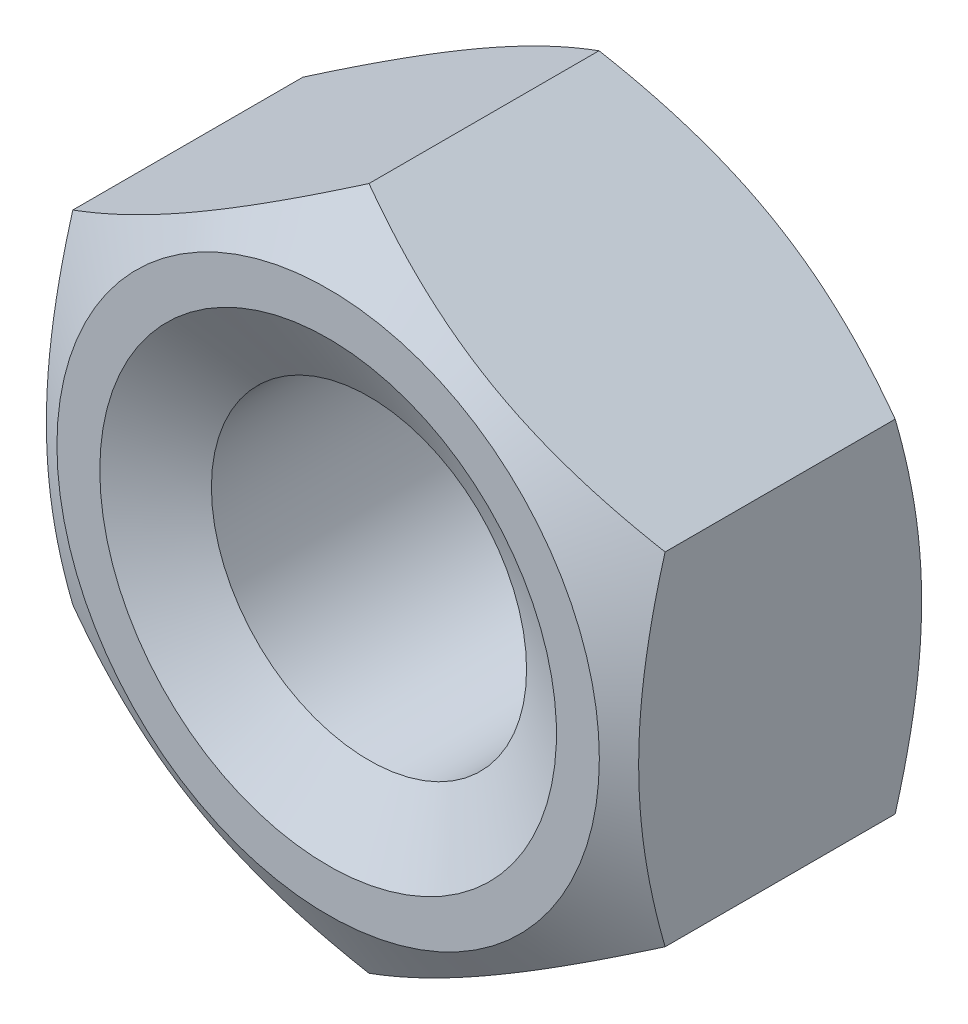
ISO-10303-21;
HEADER;
FILE_DESCRIPTION(('STEP AP214'),'2;1');
FILE_NAME('part.step','',(''),(''),'','','');
FILE_SCHEMA(('AUTOMOTIVE_DESIGN { 1 0 10303 214 1 1 1 1 }'));
ENDSEC;
DATA;
#1=APPLICATION_CONTEXT('core data for automotive mechanical design processes');
#2=APPLICATION_PROTOCOL_DEFINITION('international standard','automotive_design',2000,#1);
#3=PRODUCT_CONTEXT('',#1,'mechanical');
#4=PRODUCT('Part','Part','',(#3));
#5=PRODUCT_RELATED_PRODUCT_CATEGORY('part','',(#4));
#6=PRODUCT_DEFINITION_FORMATION('','',#4);
#7=PRODUCT_DEFINITION_CONTEXT('part definition',#1,'design');
#8=PRODUCT_DEFINITION('design','',#6,#7);
#9=PRODUCT_DEFINITION_SHAPE('','',#8);
#10=(LENGTH_UNIT() NAMED_UNIT(*) SI_UNIT(.MILLI.,.METRE.));
#11=(NAMED_UNIT(*) PLANE_ANGLE_UNIT() SI_UNIT($,.RADIAN.));
#12=(NAMED_UNIT(*) SI_UNIT($,.STERADIAN.) SOLID_ANGLE_UNIT());
#13=UNCERTAINTY_MEASURE_WITH_UNIT(LENGTH_MEASURE(1.E-05),#10,'distance_accuracy_value','');
#14=(GEOMETRIC_REPRESENTATION_CONTEXT(3) GLOBAL_UNCERTAINTY_ASSIGNED_CONTEXT((#13)) GLOBAL_UNIT_ASSIGNED_CONTEXT((#10,
#11,#12)) REPRESENTATION_CONTEXT('',''));
#15=CARTESIAN_POINT('',(0.,0.,0.));
#16=DIRECTION('',(0.,0.,1.));
#17=DIRECTION('',(1.,0.,0.));
#18=AXIS2_PLACEMENT_3D('',#15,#16,#17);
#19=CARTESIAN_POINT('',(0.,0.,0.));
#20=DIRECTION('',(0.,0.,-1.));
#21=DIRECTION('',(-1.,0.,0.));
#22=AXIS2_PLACEMENT_3D('',#19,#20,#21);
#23=CONICAL_SURFACE('',#22,7.32465511460289,1.0471975511966);
#24=CARTESIAN_POINT('',(0.,0.,1.31038599138359));
#25=DIRECTION('',(0.,0.,-1.));
#26=DIRECTION('',(-1.,0.,0.));
#27=AXIS2_PLACEMENT_3D('',#24,#25,#26);
#28=CIRCLE('',#27,5.055);
#29=CARTESIAN_POINT('',(-5.055,0.,1.31038599138359));
#30=VERTEX_POINT('',#29);
#31=EDGE_CURVE('E11',#30,#30,#28,.T.);
#32=ORIENTED_EDGE('',*,*,#31,.T.);
#33=EDGE_LOOP('',(#32));
#34=FACE_BOUND('',#33,.T.);
#35=CARTESIAN_POINT('',(0.,0.,0.));
#36=DIRECTION('',(0.,0.,-1.));
#37=DIRECTION('',(-1.,0.,0.));
#38=AXIS2_PLACEMENT_3D('',#35,#36,#37);
#39=CIRCLE('',#38,7.32465511460289);
#40=CARTESIAN_POINT('',(-7.32465511460289,0.,0.));
#41=VERTEX_POINT('',#40);
#42=EDGE_CURVE('E72',#41,#41,#39,.T.);
#43=ORIENTED_EDGE('',*,*,#42,.F.);
#44=EDGE_LOOP('',(#43));
#45=FACE_BOUND('',#44,.T.);
#46=ADVANCED_FACE('F59',(#34,#45),#23,.T.);
#47=CARTESIAN_POINT('',(0.,0.,0.));
#48=DIRECTION('',(0.,0.,-1.));
#49=DIRECTION('',(-1.,0.,0.));
#50=AXIS2_PLACEMENT_3D('',#47,#48,#49);
#51=CYLINDRICAL_SURFACE('',#50,5.055);
#52=CARTESIAN_POINT('',(0.,0.,0.));
#53=DIRECTION('',(0.,0.,-1.));
#54=DIRECTION('',(-1.,0.,0.));
#55=AXIS2_PLACEMENT_3D('',#52,#53,#54);
#56=CIRCLE('',#55,5.055);
#57=CARTESIAN_POINT('',(-5.055,0.,0.));
#58=VERTEX_POINT('',#57);
#59=EDGE_CURVE('E66',#58,#58,#56,.T.);
#60=ORIENTED_EDGE('',*,*,#59,.T.);
#61=EDGE_LOOP('',(#60));
#62=FACE_BOUND('',#61,.T.);
#63=ORIENTED_EDGE('',*,*,#31,.F.);
#64=EDGE_LOOP('',(#63));
#65=FACE_BOUND('',#64,.T.);
#66=ADVANCED_FACE('F86',(#62,#65),#51,.F.);
#67=CARTESIAN_POINT('',(0.,0.,0.));
#68=DIRECTION('',(0.,0.,1.));
#69=DIRECTION('',(1.,0.,0.));
#70=AXIS2_PLACEMENT_3D('',#67,#68,#69);
#71=PLANE('',#70);
#72=ORIENTED_EDGE('',*,*,#59,.F.);
#73=EDGE_LOOP('',(#72));
#74=FACE_BOUND('',#73,.T.);
#75=ORIENTED_EDGE('',*,*,#42,.T.);
#76=EDGE_LOOP('',(#75));
#77=FACE_BOUND('',#76,.T.);
#78=ADVANCED_FACE('F83',(#74,#77),#71,.F.);
#79=CLOSED_SHELL('',(#46,#66,#78));
#80=MANIFOLD_SOLID_BREP('B2_NOT_SHOWN',#79);
#81=CARTESIAN_POINT('',(0.,10.9696551146029,10.));
#82=DIRECTION('',(0.,0.,1.));
#83=DIRECTION('',(1.,0.,0.));
#84=AXIS2_PLACEMENT_3D('',#81,#82,#83);
#85=PLANE('',#84);
#86=CARTESIAN_POINT('',(0.,0.,10.));
#87=DIRECTION('',(0.,0.,-1.));
#88=DIRECTION('',(-1.,0.,0.));
#89=AXIS2_PLACEMENT_3D('',#86,#87,#88);
#90=CIRCLE('',#89,7.32465511460289);
#91=CARTESIAN_POINT('',(-7.32465511460289,0.,10.));
#92=VERTEX_POINT('',#91);
#93=EDGE_CURVE('E383',#92,#92,#90,.T.);
#94=ORIENTED_EDGE('',*,*,#93,.T.);
#95=EDGE_LOOP('',(#94));
#96=FACE_BOUND('',#95,.T.);
#97=CARTESIAN_POINT('',(0.,0.,10.));
#98=DIRECTION('',(0.,0.,-1.));
#99=DIRECTION('',(-1.,0.,0.));
#100=AXIS2_PLACEMENT_3D('',#97,#98,#99);
#101=CIRCLE('',#100,8.7);
#102=CARTESIAN_POINT('',(-8.7,0.,10.));
#103=VERTEX_POINT('',#102);
#104=EDGE_CURVE('E419',#103,#103,#101,.T.);
#105=ORIENTED_EDGE('',*,*,#104,.F.);
#106=EDGE_LOOP('',(#105));
#107=FACE_BOUND('',#106,.T.);
#108=ADVANCED_FACE('F140',(#96,#107),#85,.T.);
#109=CARTESIAN_POINT('',(9.5,5.48482755730145,10.));
#110=DIRECTION('',(-0.5,-0.866025403784439,0.));
#111=DIRECTION('',(0.866025403784439,-0.5,0.));
#112=AXIS2_PLACEMENT_3D('',#109,#110,#111);
#113=PLANE('',#112);
#114=DIRECTION('',(0.,0.,-1.));
#115=VECTOR('',#114,1.);
#116=CARTESIAN_POINT('',(9.5,5.48482755730145,10.));
#117=LINE('',#116,#115);
#118=CARTESIAN_POINT('',(9.5,5.48482755730145,8.68961400861641));
#119=VERTEX_POINT('',#118);
#120=CARTESIAN_POINT('',(9.5,5.48482755730145,1.31038599138359));
#121=VERTEX_POINT('',#120);
#122=EDGE_CURVE('E333',#119,#121,#117,.T.);
#123=ORIENTED_EDGE('',*,*,#122,.T.);
#124=CARTESIAN_POINT('',(9.5002,5.48471208724761,1.31045265910288));
#125=CARTESIAN_POINT('',(9.2913692288712,5.6052805891739,1.24085365468098));
#126=CARTESIAN_POINT('',(9.08175982754029,5.72629863345697,1.17441352240998));
#127=CARTESIAN_POINT('',(8.66086011227496,5.96930519736725,1.04872749575279));
#128=CARTESIAN_POINT('',(8.44956926969831,6.09129402220618,0.989483967537573));
#129=CARTESIAN_POINT('',(7.81229220083568,6.4592261094624,0.823694790431426));
#130=CARTESIAN_POINT('',(7.38379023575747,6.70662183434858,0.729394657421094));
#131=CARTESIAN_POINT('',(6.74255666069622,7.07683821152362,0.618818920593052));
#132=CARTESIAN_POINT('',(6.53174078293651,7.19855281529764,0.587320041658466));
#133=CARTESIAN_POINT('',(6.10913296059818,7.44254555528632,0.534498416940679));
#134=CARTESIAN_POINT('',(5.89734099731245,7.56482370230153,0.513175867017071));
#135=CARTESIAN_POINT('',(5.4734037856792,7.80958396555748,0.48125323581606));
#136=CARTESIAN_POINT('',(5.26125925866044,7.93206566533888,0.470640412540437));
#137=CARTESIAN_POINT('',(4.83677424680351,8.17714220120143,0.460362746517624));
#138=CARTESIAN_POINT('',(4.62443376822235,8.29973703367012,0.460697565522113));
#139=CARTESIAN_POINT('',(4.22745800825054,8.5289310955516,0.471553583089819));
#140=CARTESIAN_POINT('',(4.04279470843806,8.63554650140778,0.480750481727984));
#141=CARTESIAN_POINT('',(3.67389999684453,8.84852796244894,0.507245611204387));
#142=CARTESIAN_POINT('',(3.48966861654135,8.95489399946015,0.524544415120615));
#143=CARTESIAN_POINT('',(2.93768832956799,9.27357996673159,0.588184696860883));
#144=CARTESIAN_POINT('',(2.57091646734156,9.4853358001192,0.646262115842838));
#145=CARTESIAN_POINT('',(1.83348217491638,9.91109368736054,0.791456230457954));
#146=CARTESIAN_POINT('',(1.46291385735737,10.1250414052564,0.879188384223139));
#147=CARTESIAN_POINT('',(0.72730328298902,10.5497463683867,1.07830395277129));
#148=CARTESIAN_POINT('',(0.362251606455998,10.7605090521011,1.18964060204737));
#149=CARTESIAN_POINT('',(-0.000199999999997717,10.9697705846567,1.31045265910288));
#150=B_SPLINE_CURVE_WITH_KNOTS('',3,(#124,#125,#126,#127,#128,#129,#130,#131,#132,#133,#134,
#135,#136,#137,#138,#139,#140,#141,#142,#143,#144,#145,#146,#147,#148,#149),.UNSPECIFIED.,.F.,
.F.,(4,2,2,2,2,2,2,2,2,2,2,2,4),(0.,0.752880503268236,1.50600787988545,3.0154687011471,
3.75167336599938,4.48789219970676,5.22323407372947,5.95855322798176,6.59868084929542,
7.23885375606397,8.52010929438168,9.82978009330494,11.1368800075143),.UNSPECIFIED.);
#151=CARTESIAN_POINT('',(0.,10.9696551146029,1.31038599138359));
#152=VERTEX_POINT('',#151);
#153=EDGE_CURVE('E163',#121,#152,#150,.T.);
#154=ORIENTED_EDGE('',*,*,#153,.T.);
#155=DIRECTION('',(0.,0.,-1.));
#156=VECTOR('',#155,1.);
#157=CARTESIAN_POINT('',(0.,10.9696551146029,10.));
#158=LINE('',#157,#156);
#159=CARTESIAN_POINT('',(0.,10.9696551146029,8.68961400861641));
#160=VERTEX_POINT('',#159);
#161=EDGE_CURVE('E217',#160,#152,#158,.T.);
#162=ORIENTED_EDGE('',*,*,#161,.F.);
#163=CARTESIAN_POINT('',(-0.000199999999998075,10.9697705846567,8.68954734089712));
#164=CARTESIAN_POINT('',(0.208630771128801,10.8492020827304,8.75914634531902));
#165=CARTESIAN_POINT('',(0.418240172459709,10.7281840384474,8.82558647759002));
#166=CARTESIAN_POINT('',(0.839139887725037,10.4851774745371,8.95127250424721));
#167=CARTESIAN_POINT('',(1.05043073030169,10.3631886496982,9.01051603246243));
#168=CARTESIAN_POINT('',(1.68770779916432,9.99525656244194,9.17630520956857));
#169=CARTESIAN_POINT('',(2.11620976424253,9.74786083755575,9.27060534257891));
#170=CARTESIAN_POINT('',(2.75744333930378,9.37764446038071,9.38118107940695));
#171=CARTESIAN_POINT('',(2.96825921706349,9.25592985660669,9.41267995834153));
#172=CARTESIAN_POINT('',(3.39086703940182,9.01193711661802,9.46550158305932));
#173=CARTESIAN_POINT('',(3.60265900268754,8.88965896960281,9.48682413298293));
#174=CARTESIAN_POINT('',(4.0265962143208,8.64489870634685,9.51874676418394));
#175=CARTESIAN_POINT('',(4.23874074133956,8.52241700656546,9.52935958745956));
#176=CARTESIAN_POINT('',(4.66322575319649,8.2773404707029,9.53963725348238));
#177=CARTESIAN_POINT('',(4.87556623177765,8.15474563823422,9.53930243447789));
#178=CARTESIAN_POINT('',(5.27254199174946,7.92555157635273,9.52844641691018));
#179=CARTESIAN_POINT('',(5.45720529156194,7.81893617049655,9.51924951827202));
#180=CARTESIAN_POINT('',(5.82610000315547,7.6059547094554,9.49275438879561));
#181=CARTESIAN_POINT('',(6.01033138345865,7.49958867244418,9.47545558487939));
#182=CARTESIAN_POINT('',(6.56231167043201,7.18090270517275,9.41181530313912));
#183=CARTESIAN_POINT('',(6.92908353265844,6.96914687178514,9.35373788415716));
#184=CARTESIAN_POINT('',(7.66651782508362,6.5433889845438,9.20854376954205));
#185=CARTESIAN_POINT('',(8.03708614264263,6.32944126664795,9.12081161577686));
#186=CARTESIAN_POINT('',(8.77269671701098,5.90473630351765,8.92169604722872));
#187=CARTESIAN_POINT('',(9.137748393544,5.69397361980319,8.81035939795264));
#188=CARTESIAN_POINT('',(9.5002,5.48471208724761,8.68954734089712));
#189=B_SPLINE_CURVE_WITH_KNOTS('',3,(#163,#164,#165,#166,#167,#168,#169,#170,#171,#172,#173,
#174,#175,#176,#177,#178,#179,#180,#181,#182,#183,#184,#185,#186,#187,#188),.UNSPECIFIED.,.F.,
.F.,(4,2,2,2,2,2,2,2,2,2,2,2,4),(0.,0.752880503268236,1.50600787988546,3.0154687011471,
3.75167336599938,4.48789219970676,5.22323407372947,5.95855322798176,6.59868084929542,
7.23885375606398,8.52010929438168,9.82978009330494,11.1368800075143),.UNSPECIFIED.);
#190=EDGE_CURVE('E321',#160,#119,#189,.T.);
#191=ORIENTED_EDGE('',*,*,#190,.T.);
#192=EDGE_LOOP('',(#123,#154,#162,#191));
#193=FACE_BOUND('',#192,.T.);
#194=ADVANCED_FACE('F142',(#193),#113,.F.);
#195=CARTESIAN_POINT('',(0.,10.9696551146029,10.));
#196=DIRECTION('',(0.5,-0.866025403784439,0.));
#197=DIRECTION('',(0.866025403784439,0.5,0.));
#198=AXIS2_PLACEMENT_3D('',#195,#196,#197);
#199=PLANE('',#198);
#200=ORIENTED_EDGE('',*,*,#161,.T.);
#201=CARTESIAN_POINT('',(0.000200000000001962,10.9697705846567,1.31045265910288));
#202=CARTESIAN_POINT('',(-0.208630771128798,10.8492020827304,1.24085365468098));
#203=CARTESIAN_POINT('',(-0.418240172459706,10.7281840384474,1.17441352240998));
#204=CARTESIAN_POINT('',(-0.839139887725034,10.4851774745371,1.04872749575279));
#205=CARTESIAN_POINT('',(-1.05043073030168,10.3631886496982,0.989483967537574));
#206=CARTESIAN_POINT('',(-1.68770779916432,9.99525656244194,0.823694790431426));
#207=CARTESIAN_POINT('',(-2.11620976424253,9.74786083755575,0.729394657421094));
#208=CARTESIAN_POINT('',(-2.75744333930377,9.37764446038071,0.618818920593052));
#209=CARTESIAN_POINT('',(-2.96825921706349,9.25592985660669,0.587320041658465));
#210=CARTESIAN_POINT('',(-3.39086703940182,9.01193711661802,0.534498416940679));
#211=CARTESIAN_POINT('',(-3.60265900268754,8.88965896960281,0.513175867017072));
#212=CARTESIAN_POINT('',(-4.02659621432079,8.64489870634685,0.481253235816061));
#213=CARTESIAN_POINT('',(-4.23874074133956,8.52241700656546,0.470640412540437));
#214=CARTESIAN_POINT('',(-4.66322575319649,8.2773404707029,0.460362746517623));
#215=CARTESIAN_POINT('',(-4.87556623177764,8.15474563823422,0.460697565522112));
#216=CARTESIAN_POINT('',(-5.27254199174946,7.92555157635273,0.471553583089817));
#217=CARTESIAN_POINT('',(-5.45720529156194,7.81893617049655,0.480750481727982));
#218=CARTESIAN_POINT('',(-5.82610000315547,7.6059547094554,0.507245611204385));
#219=CARTESIAN_POINT('',(-6.01033138345865,7.49958867244418,0.524544415120613));
#220=CARTESIAN_POINT('',(-6.56231167043201,7.18090270517275,0.588184696860882));
#221=CARTESIAN_POINT('',(-6.92908353265844,6.96914687178513,0.646262115842838));
#222=CARTESIAN_POINT('',(-7.66651782508361,6.5433889845438,0.791456230457953));
#223=CARTESIAN_POINT('',(-8.03708614264263,6.32944126664795,0.879188384223138));
#224=CARTESIAN_POINT('',(-8.77269671701098,5.90473630351765,1.07830395277129));
#225=CARTESIAN_POINT('',(-9.137748393544,5.69397361980319,1.18964060204737));
#226=CARTESIAN_POINT('',(-9.5002,5.48471208724761,1.31045265910288));
#227=B_SPLINE_CURVE_WITH_KNOTS('',3,(#201,#202,#203,#204,#205,#206,#207,#208,#209,#210,#211,
#212,#213,#214,#215,#216,#217,#218,#219,#220,#221,#222,#223,#224,#225,#226),.UNSPECIFIED.,.F.,
.F.,(4,2,2,2,2,2,2,2,2,2,2,2,4),(0.,0.752880503268236,1.50600787988545,3.01546870114711,
3.75167336599938,4.48789219970676,5.22323407372947,5.95855322798176,6.59868084929542,
7.23885375606398,8.52010929438168,9.82978009330495,11.1368800075143),.UNSPECIFIED.);
#228=CARTESIAN_POINT('',(-9.5,5.48482755730145,1.31038599138359));
#229=VERTEX_POINT('',#228);
#230=EDGE_CURVE('E201',#152,#229,#227,.T.);
#231=ORIENTED_EDGE('',*,*,#230,.T.);
#232=DIRECTION('',(0.,0.,-1.));
#233=VECTOR('',#232,1.);
#234=CARTESIAN_POINT('',(-9.5,5.48482755730145,10.));
#235=LINE('',#234,#233);
#236=CARTESIAN_POINT('',(-9.5,5.48482755730145,8.68961400861641));
#237=VERTEX_POINT('',#236);
#238=EDGE_CURVE('E215',#237,#229,#235,.T.);
#239=ORIENTED_EDGE('',*,*,#238,.F.);
#240=CARTESIAN_POINT('',(-9.5002,5.48471208724761,8.68954734089712));
#241=CARTESIAN_POINT('',(-9.2913692288712,5.6052805891739,8.75914634531902));
#242=CARTESIAN_POINT('',(-9.08175982754029,5.72629863345697,8.82558647759002));
#243=CARTESIAN_POINT('',(-8.66086011227496,5.96930519736725,8.95127250424721));
#244=CARTESIAN_POINT('',(-8.44956926969831,6.09129402220618,9.01051603246243));
#245=CARTESIAN_POINT('',(-7.81229220083568,6.4592261094624,9.17630520956857));
#246=CARTESIAN_POINT('',(-7.38379023575747,6.70662183434858,9.27060534257891));
#247=CARTESIAN_POINT('',(-6.74255666069622,7.07683821152362,9.38118107940695));
#248=CARTESIAN_POINT('',(-6.53174078293651,7.19855281529764,9.41267995834153));
#249=CARTESIAN_POINT('',(-6.10913296059818,7.44254555528631,9.46550158305932));
#250=CARTESIAN_POINT('',(-5.89734099731245,7.56482370230153,9.48682413298293));
#251=CARTESIAN_POINT('',(-5.4734037856792,7.80958396555748,9.51874676418394));
#252=CARTESIAN_POINT('',(-5.26125925866044,7.93206566533887,9.52935958745956));
#253=CARTESIAN_POINT('',(-4.83677424680351,8.17714220120143,9.53963725348238));
#254=CARTESIAN_POINT('',(-4.62443376822235,8.29973703367012,9.53930243447789));
#255=CARTESIAN_POINT('',(-4.22745800825054,8.5289310955516,9.52844641691018));
#256=CARTESIAN_POINT('',(-4.04279470843806,8.63554650140778,9.51924951827202));
#257=CARTESIAN_POINT('',(-3.67389999684453,8.84852796244893,9.49275438879562));
#258=CARTESIAN_POINT('',(-3.48966861654135,8.95489399946015,9.47545558487939));
#259=CARTESIAN_POINT('',(-2.93768832956799,9.27357996673159,9.41181530313912));
#260=CARTESIAN_POINT('',(-2.57091646734156,9.4853358001192,9.35373788415716));
#261=CARTESIAN_POINT('',(-1.83348217491638,9.91109368736053,9.20854376954205));
#262=CARTESIAN_POINT('',(-1.46291385735737,10.1250414052564,9.12081161577686));
#263=CARTESIAN_POINT('',(-0.727303282989019,10.5497463683867,8.92169604722871));
#264=CARTESIAN_POINT('',(-0.362251606455996,10.7605090521011,8.81035939795263));
#265=CARTESIAN_POINT('',(0.000200000000001438,10.9697705846567,8.68954734089712));
#266=B_SPLINE_CURVE_WITH_KNOTS('',3,(#240,#241,#242,#243,#244,#245,#246,#247,#248,#249,#250,
#251,#252,#253,#254,#255,#256,#257,#258,#259,#260,#261,#262,#263,#264,#265),.UNSPECIFIED.,.F.,
.F.,(4,2,2,2,2,2,2,2,2,2,2,2,4),(0.,0.752880503268237,1.50600787988546,3.01546870114711,
3.75167336599938,4.48789219970676,5.22323407372947,5.95855322798176,6.59868084929542,
7.23885375606398,8.52010929438168,9.82978009330494,11.1368800075143),.UNSPECIFIED.);
#267=EDGE_CURVE('E313',#237,#160,#266,.T.);
#268=ORIENTED_EDGE('',*,*,#267,.T.);
#269=EDGE_LOOP('',(#200,#231,#239,#268));
#270=FACE_BOUND('',#269,.T.);
#271=ADVANCED_FACE('F213',(#270),#199,.F.);
#272=CARTESIAN_POINT('',(-9.5,5.48482755730145,10.));
#273=DIRECTION('',(1.,0.,0.));
#274=DIRECTION('',(0.,0.,-1.));
#275=AXIS2_PLACEMENT_3D('',#272,#273,#274);
#276=PLANE('',#275);
#277=ORIENTED_EDGE('',*,*,#238,.T.);
#278=CARTESIAN_POINT('',(-9.5,-14.4826053834788,4.9769836360382));
#279=CARTESIAN_POINT('',(-9.5,-14.274308286317,4.87642892245925));
#280=CARTESIAN_POINT('',(-9.5,-14.0657575884219,4.77639979207339));
#281=CARTESIAN_POINT('',(-9.5,-13.6480953971927,4.57751348963757));
#282=CARTESIAN_POINT('',(-9.5,-13.4389838976277,4.47865633067585));
#283=CARTESIAN_POINT('',(-9.5,-12.8106655274125,4.18399487422787));
#284=CARTESIAN_POINT('',(-9.5,-12.3905436379291,3.99013393267018));
#285=CARTESIAN_POINT('',(-9.5,-11.5449378733149,3.60773584004909));
#286=CARTESIAN_POINT('',(-9.5,-11.1194370298381,3.41923611534575));
#287=CARTESIAN_POINT('',(-9.5,-10.2649151056443,3.05042264034236));
#288=CARTESIAN_POINT('',(-9.5,-9.83589421206677,2.87010845815446));
#289=CARTESIAN_POINT('',(-9.5,-8.96862183298025,2.51783209014271));
#290=CARTESIAN_POINT('',(-9.5,-8.53032098484838,2.34599075497593));
#291=CARTESIAN_POINT('',(-9.5,-7.64852804882226,2.01592674804749));
#292=CARTESIAN_POINT('',(-9.5,-7.20503538723856,1.85770559774854));
#293=CARTESIAN_POINT('',(-9.5,-6.31308017447963,1.55918109966772));
#294=CARTESIAN_POINT('',(-9.5,-5.86463070608187,1.41883909225077));
#295=CARTESIAN_POINT('',(-9.5,-4.96137597057703,1.16066945869116));
#296=CARTESIAN_POINT('',(-9.5,-4.50657277972491,1.04283465420689));
#297=CARTESIAN_POINT('',(-9.5,-3.59019834298986,0.835443630264487));
#298=CARTESIAN_POINT('',(-9.5,-3.12862455386896,0.745898337409719));
#299=CARTESIAN_POINT('',(-9.5,-2.43225744960733,0.637317631955129));
#300=CARTESIAN_POINT('',(-9.5,-2.19943869951144,0.605411280860039));
#301=CARTESIAN_POINT('',(-9.5,-1.73273124603338,0.550806343067465));
#302=CARTESIAN_POINT('',(-9.5,-1.49884264582319,0.528106886667666));
#303=CARTESIAN_POINT('',(-9.5,-1.03175929271859,0.492523692128243));
#304=CARTESIAN_POINT('',(-9.5,-0.798569077145608,0.479580628726996));
#305=CARTESIAN_POINT('',(-9.5,-0.331850583147132,0.463577552357017));
#306=CARTESIAN_POINT('',(-9.5,-0.0983223098102125,0.460517392143201));
#307=CARTESIAN_POINT('',(-9.5,0.368589028514875,0.464352772591687));
#308=CARTESIAN_POINT('',(-9.5,0.601972115774128,0.471245576044207));
#309=CARTESIAN_POINT('',(-9.5,1.06824686470045,0.494817353475869));
#310=CARTESIAN_POINT('',(-9.5,1.30113849895141,0.511496859648964));
#311=CARTESIAN_POINT('',(-9.5,1.86749317002041,0.563613621799929));
#312=CARTESIAN_POINT('',(-9.5,2.20050408062932,0.604059759156962));
#313=CARTESIAN_POINT('',(-9.5,2.86387388521982,0.702694647855884));
#314=CARTESIAN_POINT('',(-9.5,3.19423236959569,0.760886087446713));
#315=CARTESIAN_POINT('',(-9.5,4.1819268782698,0.959154802737508));
#316=CARTESIAN_POINT('',(-9.5,4.83458595340049,1.1227921533504));
#317=CARTESIAN_POINT('',(-9.5,5.81072887056404,1.40440749078049));
#318=CARTESIAN_POINT('',(-9.5,6.13932626962746,1.50566201990085));
#319=CARTESIAN_POINT('',(-9.5,6.79334665221704,1.7181334320536));
#320=CARTESIAN_POINT('',(-9.5,7.11876934927604,1.8293512050592));
#321=CARTESIAN_POINT('',(-9.5,7.76481452132392,2.05937608053664));
#322=CARTESIAN_POINT('',(-9.5,8.08545374703252,2.17813661227853));
#323=CARTESIAN_POINT('',(-9.5,8.72401298257501,2.42244918353631));
#324=CARTESIAN_POINT('',(-9.5,9.04193388974072,2.54799887309201));
#325=CARTESIAN_POINT('',(-9.5,9.35871180000457,2.67630557755582));
#326=B_SPLINE_CURVE_WITH_KNOTS('',3,(#278,#279,#280,#281,#282,#283,#284,#285,#286,#287,#288,
#289,#290,#291,#292,#293,#294,#295,#296,#297,#298,#299,#300,#301,#302,#303,#304,#305,#306,#307,
#308,#309,#310,#311,#312,#313,#314,#315,#316,#317,#318,#319,#320,#321,#322,#323,#324,#325),
.UNSPECIFIED.,.F.,.F.,(4,2,2,2,2,2,2,2,2,2,2,2,2,2,2,2,2,2,2,2,2,2,2,4),(0.,0.693893710437442,
1.38779516279439,2.77582754742075,4.17191544886763,5.56792960372386,6.98010459413844,
8.39243712947845,9.80166201986792,11.2104367054526,12.619754855916,13.3245859119861,
14.029350372742,14.7297940447751,15.4302272808703,16.1304679243211,16.830746649891,
17.8365482212062,18.8425022379017,20.8583017739623,21.8897555980204,22.9213016494033,
23.9470030653944,24.972351695631),.UNSPECIFIED.);
#327=CARTESIAN_POINT('',(-9.5,-5.48482755730145,1.31038599138359));
#328=VERTEX_POINT('',#327);
#329=EDGE_CURVE('E198',#229,#328,#326,.F.);
#330=ORIENTED_EDGE('',*,*,#329,.T.);
#331=DIRECTION('',(0.,0.,-1.));
#332=VECTOR('',#331,1.);
#333=CARTESIAN_POINT('',(-9.5,-5.48482755730145,10.));
#334=LINE('',#333,#332);
#335=CARTESIAN_POINT('',(-9.5,-5.48482755730145,8.68961400861641));
#336=VERTEX_POINT('',#335);
#337=EDGE_CURVE('E224',#336,#328,#334,.T.);
#338=ORIENTED_EDGE('',*,*,#337,.F.);
#339=CARTESIAN_POINT('',(-9.5,-14.4826053834788,5.02301636396179));
#340=CARTESIAN_POINT('',(-9.5,-14.274308286317,5.12357107754075));
#341=CARTESIAN_POINT('',(-9.5,-14.0657575884219,5.22360020792661));
#342=CARTESIAN_POINT('',(-9.5,-13.6480953971927,5.42248651036243));
#343=CARTESIAN_POINT('',(-9.5,-13.4389838976277,5.52134366932415));
#344=CARTESIAN_POINT('',(-9.5,-12.8106655274125,5.81600512577213));
#345=CARTESIAN_POINT('',(-9.5,-12.3905436379292,6.00986606732982));
#346=CARTESIAN_POINT('',(-9.5,-11.5449378733149,6.39226415995091));
#347=CARTESIAN_POINT('',(-9.5,-11.1194370298381,6.58076388465424));
#348=CARTESIAN_POINT('',(-9.5,-10.2649151056443,6.94957735965764));
#349=CARTESIAN_POINT('',(-9.5,-9.83589421206677,7.12989154184554));
#350=CARTESIAN_POINT('',(-9.5,-8.96862183298025,7.48216790985729));
#351=CARTESIAN_POINT('',(-9.5,-8.53032098484838,7.65400924502407));
#352=CARTESIAN_POINT('',(-9.5,-7.64852804882226,7.98407325195251));
#353=CARTESIAN_POINT('',(-9.5,-7.20503538723856,8.14229440225146));
#354=CARTESIAN_POINT('',(-9.5,-6.31308017447963,8.44081890033228));
#355=CARTESIAN_POINT('',(-9.5,-5.86463070608187,8.58116090774923));
#356=CARTESIAN_POINT('',(-9.5,-4.96137597057702,8.83933054130884));
#357=CARTESIAN_POINT('',(-9.5,-4.50657277972491,8.95716534579311));
#358=CARTESIAN_POINT('',(-9.5,-3.59019834298986,9.16455636973552));
#359=CARTESIAN_POINT('',(-9.5,-3.12862455386895,9.25410166259028));
#360=CARTESIAN_POINT('',(-9.5,-2.43225744960732,9.36268236804487));
#361=CARTESIAN_POINT('',(-9.5,-2.19943869951143,9.39458871913996));
#362=CARTESIAN_POINT('',(-9.5,-1.73273124603338,9.44919365693254));
#363=CARTESIAN_POINT('',(-9.5,-1.49884264582319,9.47189311333233));
#364=CARTESIAN_POINT('',(-9.5,-1.03175929271859,9.50747630787176));
#365=CARTESIAN_POINT('',(-9.5,-0.798569077145604,9.520419371273));
#366=CARTESIAN_POINT('',(-9.5,-0.331850583147128,9.53642244764298));
#367=CARTESIAN_POINT('',(-9.5,-0.0983223098102092,9.5394826078568));
#368=CARTESIAN_POINT('',(-9.5,0.368589028514876,9.53564722740831));
#369=CARTESIAN_POINT('',(-9.5,0.601972115774129,9.52875442395579));
#370=CARTESIAN_POINT('',(-9.5,1.06824686470045,9.50518264652413));
#371=CARTESIAN_POINT('',(-9.5,1.30113849895141,9.48850314035104));
#372=CARTESIAN_POINT('',(-9.5,1.86749317002041,9.43638637820007));
#373=CARTESIAN_POINT('',(-9.5,2.20050408062932,9.39594024084304));
#374=CARTESIAN_POINT('',(-9.5,2.86387388521982,9.29730535214411));
#375=CARTESIAN_POINT('',(-9.5,3.19423236959569,9.23911391255329));
#376=CARTESIAN_POINT('',(-9.5,4.1819268782698,9.0408451972625));
#377=CARTESIAN_POINT('',(-9.5,4.83458595340048,8.87720784664961));
#378=CARTESIAN_POINT('',(-9.5,5.81072887056403,8.59559250921951));
#379=CARTESIAN_POINT('',(-9.5,6.13932626962746,8.49433798009916));
#380=CARTESIAN_POINT('',(-9.5,6.79334665221704,8.2818665679464));
#381=CARTESIAN_POINT('',(-9.5,7.11876934927604,8.1706487949408));
#382=CARTESIAN_POINT('',(-9.5,7.76481452132392,7.94062391946337));
#383=CARTESIAN_POINT('',(-9.5,8.08545374703252,7.82186338772147));
#384=CARTESIAN_POINT('',(-9.5,8.72401298257501,7.57755081646369));
#385=CARTESIAN_POINT('',(-9.5,9.04193388974072,7.45200112690799));
#386=CARTESIAN_POINT('',(-9.5,9.35871180000457,7.32369442244418));
#387=B_SPLINE_CURVE_WITH_KNOTS('',3,(#339,#340,#341,#342,#343,#344,#345,#346,#347,#348,#349,
#350,#351,#352,#353,#354,#355,#356,#357,#358,#359,#360,#361,#362,#363,#364,#365,#366,#367,#368,
#369,#370,#371,#372,#373,#374,#375,#376,#377,#378,#379,#380,#381,#382,#383,#384,#385,#386),
.UNSPECIFIED.,.F.,.F.,(4,2,2,2,2,2,2,2,2,2,2,2,2,2,2,2,2,2,2,2,2,2,2,4),(0.,0.693893710437445,
1.38779516279439,2.77582754742075,4.17191544886763,5.56792960372387,6.98010459413844,
8.39243712947845,9.80166201986793,11.2104367054526,12.619754855916,13.3245859119861,
14.029350372742,14.7297940447751,15.4302272808703,16.1304679243211,16.830746649891,
17.8365482212062,18.8425022379017,20.8583017739623,21.8897555980204,22.9213016494033,
23.9470030653944,24.972351695631),.UNSPECIFIED.);
#388=EDGE_CURVE('E222',#336,#237,#387,.T.);
#389=ORIENTED_EDGE('',*,*,#388,.T.);
#390=EDGE_LOOP('',(#277,#330,#338,#389));
#391=FACE_BOUND('',#390,.T.);
#392=ADVANCED_FACE('F221',(#391),#276,.F.);
#393=CARTESIAN_POINT('',(-9.5,-5.48482755730145,10.));
#394=DIRECTION('',(0.5,0.866025403784439,0.));
#395=DIRECTION('',(-0.866025403784439,0.5,0.));
#396=AXIS2_PLACEMENT_3D('',#393,#394,#395);
#397=PLANE('',#396);
#398=ORIENTED_EDGE('',*,*,#337,.T.);
#399=CARTESIAN_POINT('',(-9.5002,-5.48471208724761,1.31045265910288));
#400=CARTESIAN_POINT('',(-9.2913692288712,-5.6052805891739,1.24085365468098));
#401=CARTESIAN_POINT('',(-9.08175982754029,-5.72629863345697,1.17441352240998));
#402=CARTESIAN_POINT('',(-8.66086011227496,-5.96930519736725,1.04872749575279));
#403=CARTESIAN_POINT('',(-8.44956926969831,-6.09129402220618,0.989483967537574));
#404=CARTESIAN_POINT('',(-7.81229220083568,-6.4592261094624,0.823694790431426));
#405=CARTESIAN_POINT('',(-7.38379023575747,-6.70662183434858,0.729394657421094));
#406=CARTESIAN_POINT('',(-6.74255666069622,-7.07683821152362,0.618818920593053));
#407=CARTESIAN_POINT('',(-6.53174078293651,-7.19855281529764,0.587320041658466));
#408=CARTESIAN_POINT('',(-6.10913296059818,-7.44254555528632,0.53449841694068));
#409=CARTESIAN_POINT('',(-5.89734099731245,-7.56482370230153,0.513175867017072));
#410=CARTESIAN_POINT('',(-5.4734037856792,-7.80958396555748,0.481253235816061));
#411=CARTESIAN_POINT('',(-5.26125925866044,-7.93206566533888,0.470640412540438));
#412=CARTESIAN_POINT('',(-4.83677424680351,-8.17714220120143,0.460362746517624));
#413=CARTESIAN_POINT('',(-4.62443376822235,-8.29973703367012,0.460697565522113));
#414=CARTESIAN_POINT('',(-4.22745800825054,-8.5289310955516,0.471553583089819));
#415=CARTESIAN_POINT('',(-4.04279470843806,-8.63554650140778,0.480750481727984));
#416=CARTESIAN_POINT('',(-3.67389999684453,-8.84852796244894,0.507245611204388));
#417=CARTESIAN_POINT('',(-3.48966861654135,-8.95489399946015,0.524544415120615));
#418=CARTESIAN_POINT('',(-2.93768832956799,-9.27357996673159,0.588184696860883));
#419=CARTESIAN_POINT('',(-2.57091646734156,-9.4853358001192,0.646262115842839));
#420=CARTESIAN_POINT('',(-1.83348217491638,-9.91109368736054,0.791456230457954));
#421=CARTESIAN_POINT('',(-1.46291385735737,-10.1250414052564,0.879188384223139));
#422=CARTESIAN_POINT('',(-0.727303282989021,-10.5497463683867,1.07830395277129));
#423=CARTESIAN_POINT('',(-0.362251606455999,-10.7605090521011,1.18964060204737));
#424=CARTESIAN_POINT('',(0.000199999999998156,-10.9697705846567,1.31045265910288));
#425=B_SPLINE_CURVE_WITH_KNOTS('',3,(#399,#400,#401,#402,#403,#404,#405,#406,#407,#408,#409,
#410,#411,#412,#413,#414,#415,#416,#417,#418,#419,#420,#421,#422,#423,#424),.UNSPECIFIED.,.F.,
.F.,(4,2,2,2,2,2,2,2,2,2,2,2,4),(0.,0.752880503268237,1.50600787988546,3.0154687011471,
3.75167336599938,4.48789219970676,5.22323407372947,5.95855322798176,6.59868084929542,
7.23885375606397,8.52010929438167,9.82978009330494,11.1368800075143),.UNSPECIFIED.);
#426=CARTESIAN_POINT('',(0.,-10.9696551146029,1.31038599138359));
#427=VERTEX_POINT('',#426);
#428=EDGE_CURVE('E203',#328,#427,#425,.T.);
#429=ORIENTED_EDGE('',*,*,#428,.T.);
#430=DIRECTION('',(0.,0.,-1.));
#431=VECTOR('',#430,1.);
#432=CARTESIAN_POINT('',(0.,-10.9696551146029,10.));
#433=LINE('',#432,#431);
#434=CARTESIAN_POINT('',(0.,-10.9696551146029,8.68961400861641));
#435=VERTEX_POINT('',#434);
#436=EDGE_CURVE('E231',#435,#427,#433,.T.);
#437=ORIENTED_EDGE('',*,*,#436,.F.);
#438=CARTESIAN_POINT('',(0.000199999999999003,-10.9697705846567,8.68954734089712));
#439=CARTESIAN_POINT('',(-0.208630771128801,-10.8492020827304,8.75914634531902));
#440=CARTESIAN_POINT('',(-0.41824017245971,-10.7281840384474,8.82558647759002));
#441=CARTESIAN_POINT('',(-0.839139887725038,-10.4851774745371,8.95127250424721));
#442=CARTESIAN_POINT('',(-1.05043073030169,-10.3631886496982,9.01051603246242));
#443=CARTESIAN_POINT('',(-1.68770779916432,-9.99525656244194,9.17630520956857));
#444=CARTESIAN_POINT('',(-2.11620976424253,-9.74786083755575,9.27060534257891));
#445=CARTESIAN_POINT('',(-2.75744333930378,-9.37764446038071,9.38118107940695));
#446=CARTESIAN_POINT('',(-2.96825921706349,-9.25592985660669,9.41267995834153));
#447=CARTESIAN_POINT('',(-3.39086703940182,-9.01193711661802,9.46550158305932));
#448=CARTESIAN_POINT('',(-3.60265900268755,-8.88965896960281,9.48682413298293));
#449=CARTESIAN_POINT('',(-4.0265962143208,-8.64489870634685,9.51874676418394));
#450=CARTESIAN_POINT('',(-4.23874074133956,-8.52241700656546,9.52935958745956));
#451=CARTESIAN_POINT('',(-4.66322575319649,-8.2773404707029,9.53963725348238));
#452=CARTESIAN_POINT('',(-4.87556623177765,-8.15474563823422,9.53930243447789));
#453=CARTESIAN_POINT('',(-5.27254199174946,-7.92555157635273,9.52844641691018));
#454=CARTESIAN_POINT('',(-5.45720529156194,-7.81893617049655,9.51924951827202));
#455=CARTESIAN_POINT('',(-5.82610000315547,-7.6059547094554,9.49275438879561));
#456=CARTESIAN_POINT('',(-6.01033138345865,-7.49958867244418,9.47545558487939));
#457=CARTESIAN_POINT('',(-6.56231167043201,-7.18090270517275,9.41181530313912));
#458=CARTESIAN_POINT('',(-6.92908353265844,-6.96914687178514,9.35373788415716));
#459=CARTESIAN_POINT('',(-7.66651782508362,-6.5433889845438,9.20854376954205));
#460=CARTESIAN_POINT('',(-8.03708614264263,-6.32944126664796,9.12081161577686));
#461=CARTESIAN_POINT('',(-8.77269671701098,-5.90473630351765,8.92169604722872));
#462=CARTESIAN_POINT('',(-9.137748393544,-5.69397361980319,8.81035939795263));
#463=CARTESIAN_POINT('',(-9.5002,-5.48471208724761,8.68954734089712));
#464=B_SPLINE_CURVE_WITH_KNOTS('',3,(#438,#439,#440,#441,#442,#443,#444,#445,#446,#447,#448,
#449,#450,#451,#452,#453,#454,#455,#456,#457,#458,#459,#460,#461,#462,#463),.UNSPECIFIED.,.F.,
.F.,(4,2,2,2,2,2,2,2,2,2,2,2,4),(0.,0.752880503268236,1.50600787988545,3.01546870114711,
3.75167336599938,4.48789219970676,5.22323407372947,5.95855322798176,6.59868084929542,
7.23885375606398,8.52010929438168,9.82978009330494,11.1368800075143),.UNSPECIFIED.);
#465=EDGE_CURVE('E348',#435,#336,#464,.T.);
#466=ORIENTED_EDGE('',*,*,#465,.T.);
#467=EDGE_LOOP('',(#398,#429,#437,#466));
#468=FACE_BOUND('',#467,.T.);
#469=ADVANCED_FACE('F256',(#468),#397,.F.);
#470=CARTESIAN_POINT('',(0.,-10.9696551146029,10.));
#471=DIRECTION('',(-0.5,0.866025403784439,0.));
#472=DIRECTION('',(-0.866025403784439,-0.5,0.));
#473=AXIS2_PLACEMENT_3D('',#470,#471,#472);
#474=PLANE('',#473);
#475=ORIENTED_EDGE('',*,*,#436,.T.);
#476=CARTESIAN_POINT('',(-0.000200000000001053,-10.9697705846567,1.31045265910288));
#477=CARTESIAN_POINT('',(0.208630771128799,-10.8492020827304,1.24085365468098));
#478=CARTESIAN_POINT('',(0.418240172459708,-10.7281840384474,1.17441352240998));
#479=CARTESIAN_POINT('',(0.839139887725036,-10.4851774745371,1.04872749575279));
#480=CARTESIAN_POINT('',(1.05043073030168,-10.3631886496982,0.989483967537575));
#481=CARTESIAN_POINT('',(1.68770779916432,-9.99525656244194,0.823694790431427));
#482=CARTESIAN_POINT('',(2.11620976424253,-9.74786083755575,0.729394657421094));
#483=CARTESIAN_POINT('',(2.75744333930378,-9.37764446038071,0.618818920593053));
#484=CARTESIAN_POINT('',(2.96825921706349,-9.2559298566067,0.587320041658468));
#485=CARTESIAN_POINT('',(3.39086703940182,-9.01193711661802,0.534498416940682));
#486=CARTESIAN_POINT('',(3.60265900268754,-8.88965896960281,0.513175867017073));
#487=CARTESIAN_POINT('',(4.0265962143208,-8.64489870634685,0.481253235816062));
#488=CARTESIAN_POINT('',(4.23874074133956,-8.52241700656546,0.470640412540438));
#489=CARTESIAN_POINT('',(4.66322575319649,-8.2773404707029,0.460362746517625));
#490=CARTESIAN_POINT('',(4.87556623177765,-8.15474563823422,0.460697565522114));
#491=CARTESIAN_POINT('',(5.27254199174946,-7.92555157635273,0.47155358308982));
#492=CARTESIAN_POINT('',(5.45720529156194,-7.81893617049655,0.480750481727985));
#493=CARTESIAN_POINT('',(5.82610000315547,-7.6059547094554,0.507245611204388));
#494=CARTESIAN_POINT('',(6.01033138345865,-7.49958867244419,0.524544415120616));
#495=CARTESIAN_POINT('',(6.56231167043201,-7.18090270517275,0.588184696860883));
#496=CARTESIAN_POINT('',(6.92908353265844,-6.96914687178514,0.64626211584284));
#497=CARTESIAN_POINT('',(7.66651782508362,-6.5433889845438,0.791456230457955));
#498=CARTESIAN_POINT('',(8.03708614264263,-6.32944126664796,0.879188384223139));
#499=CARTESIAN_POINT('',(8.77269671701098,-5.90473630351766,1.07830395277129));
#500=CARTESIAN_POINT('',(9.137748393544,-5.69397361980319,1.18964060204737));
#501=CARTESIAN_POINT('',(9.5002,-5.48471208724761,1.31045265910288));
#502=B_SPLINE_CURVE_WITH_KNOTS('',3,(#476,#477,#478,#479,#480,#481,#482,#483,#484,#485,#486,
#487,#488,#489,#490,#491,#492,#493,#494,#495,#496,#497,#498,#499,#500,#501),.UNSPECIFIED.,.F.,
.F.,(4,2,2,2,2,2,2,2,2,2,2,2,4),(0.,0.752880503268237,1.50600787988545,3.0154687011471,
3.75167336599938,4.48789219970676,5.22323407372947,5.95855322798176,6.59868084929542,
7.23885375606398,8.52010929438168,9.82978009330494,11.1368800075143),.UNSPECIFIED.);
#503=CARTESIAN_POINT('',(9.5,-5.48482755730145,1.31038599138359));
#504=VERTEX_POINT('',#503);
#505=EDGE_CURVE('E269',#427,#504,#502,.T.);
#506=ORIENTED_EDGE('',*,*,#505,.T.);
#507=DIRECTION('',(0.,0.,-1.));
#508=VECTOR('',#507,1.);
#509=CARTESIAN_POINT('',(9.5,-5.48482755730145,10.));
#510=LINE('',#509,#508);
#511=CARTESIAN_POINT('',(9.5,-5.48482755730145,8.68961400861641));
#512=VERTEX_POINT('',#511);
#513=EDGE_CURVE('E337',#512,#504,#510,.T.);
#514=ORIENTED_EDGE('',*,*,#513,.F.);
#515=CARTESIAN_POINT('',(9.5002,-5.48471208724761,8.68954734089712));
#516=CARTESIAN_POINT('',(9.2913692288712,-5.6052805891739,8.75914634531902));
#517=CARTESIAN_POINT('',(9.08175982754029,-5.72629863345698,8.82558647759002));
#518=CARTESIAN_POINT('',(8.66086011227496,-5.96930519736725,8.95127250424721));
#519=CARTESIAN_POINT('',(8.44956926969831,-6.09129402220618,9.01051603246243));
#520=CARTESIAN_POINT('',(7.81229220083568,-6.4592261094624,9.17630520956858));
#521=CARTESIAN_POINT('',(7.38379023575747,-6.70662183434859,9.27060534257891));
#522=CARTESIAN_POINT('',(6.74255666069622,-7.07683821152362,9.38118107940695));
#523=CARTESIAN_POINT('',(6.53174078293651,-7.19855281529764,9.41267995834153));
#524=CARTESIAN_POINT('',(6.10913296059818,-7.44254555528632,9.46550158305932));
#525=CARTESIAN_POINT('',(5.89734099731245,-7.56482370230153,9.48682413298293));
#526=CARTESIAN_POINT('',(5.4734037856792,-7.80958396555749,9.51874676418394));
#527=CARTESIAN_POINT('',(5.26125925866043,-7.93206566533888,9.52935958745956));
#528=CARTESIAN_POINT('',(4.83677424680351,-8.17714220120144,9.53963725348237));
#529=CARTESIAN_POINT('',(4.62443376822235,-8.29973703367012,9.53930243447789));
#530=CARTESIAN_POINT('',(4.22745800825053,-8.52893109555161,9.52844641691018));
#531=CARTESIAN_POINT('',(4.04279470843805,-8.63554650140779,9.51924951827202));
#532=CARTESIAN_POINT('',(3.67389999684453,-8.84852796244894,9.49275438879561));
#533=CARTESIAN_POINT('',(3.48966861654135,-8.95489399946016,9.47545558487939));
#534=CARTESIAN_POINT('',(2.93768832956799,-9.27357996673159,9.41181530313912));
#535=CARTESIAN_POINT('',(2.57091646734155,-9.4853358001192,9.35373788415716));
#536=CARTESIAN_POINT('',(1.83348217491638,-9.91109368736054,9.20854376954205));
#537=CARTESIAN_POINT('',(1.46291385735736,-10.1250414052564,9.12081161577686));
#538=CARTESIAN_POINT('',(0.727303282989018,-10.5497463683867,8.92169604722871));
#539=CARTESIAN_POINT('',(0.362251606455996,-10.7605090521011,8.81035939795263));
#540=CARTESIAN_POINT('',(-0.000200000000000913,-10.9697705846567,8.68954734089712));
#541=B_SPLINE_CURVE_WITH_KNOTS('',3,(#515,#516,#517,#518,#519,#520,#521,#522,#523,#524,#525,
#526,#527,#528,#529,#530,#531,#532,#533,#534,#535,#536,#537,#538,#539,#540),.UNSPECIFIED.,.F.,
.F.,(4,2,2,2,2,2,2,2,2,2,2,2,4),(0.,0.752880503268236,1.50600787988545,3.0154687011471,
3.75167336599938,4.48789219970676,5.22323407372947,5.95855322798176,6.59868084929542,
7.23885375606398,8.52010929438168,9.82978009330494,11.1368800075143),.UNSPECIFIED.);
#542=EDGE_CURVE('E170',#512,#435,#541,.T.);
#543=ORIENTED_EDGE('',*,*,#542,.T.);
#544=EDGE_LOOP('',(#475,#506,#514,#543));
#545=FACE_BOUND('',#544,.T.);
#546=ADVANCED_FACE('F248',(#545),#474,.F.);
#547=CARTESIAN_POINT('',(9.5,-5.48482755730145,10.));
#548=DIRECTION('',(-1.,0.,0.));
#549=DIRECTION('',(0.,0.,1.));
#550=AXIS2_PLACEMENT_3D('',#547,#548,#549);
#551=PLANE('',#550);
#552=ORIENTED_EDGE('',*,*,#513,.T.);
#553=CARTESIAN_POINT('',(9.5,-14.4826053834788,4.97698363603821));
#554=CARTESIAN_POINT('',(9.5,-14.274308286317,4.87642892245925));
#555=CARTESIAN_POINT('',(9.5,-14.0657575884219,4.77639979207339));
#556=CARTESIAN_POINT('',(9.5,-13.6480953971927,4.57751348963757));
#557=CARTESIAN_POINT('',(9.5,-13.4389838976277,4.47865633067585));
#558=CARTESIAN_POINT('',(9.5,-12.8106655274125,4.18399487422787));
#559=CARTESIAN_POINT('',(9.5,-12.3905436379292,3.99013393267018));
#560=CARTESIAN_POINT('',(9.5,-11.5449378733149,3.60773584004909));
#561=CARTESIAN_POINT('',(9.5,-11.1194370298381,3.41923611534576));
#562=CARTESIAN_POINT('',(9.5,-10.2649151056443,3.05042264034236));
#563=CARTESIAN_POINT('',(9.5,-9.83589421206677,2.87010845815446));
#564=CARTESIAN_POINT('',(9.5,-8.96862183298026,2.51783209014271));
#565=CARTESIAN_POINT('',(9.5,-8.53032098484839,2.34599075497593));
#566=CARTESIAN_POINT('',(9.5,-7.64852804882227,2.01592674804749));
#567=CARTESIAN_POINT('',(9.5,-7.20503538723856,1.85770559774854));
#568=CARTESIAN_POINT('',(9.5,-6.31308017447963,1.55918109966772));
#569=CARTESIAN_POINT('',(9.5,-5.86463070608188,1.41883909225077));
#570=CARTESIAN_POINT('',(9.5,-4.96137597057703,1.16066945869116));
#571=CARTESIAN_POINT('',(9.5,-4.50657277972491,1.04283465420689));
#572=CARTESIAN_POINT('',(9.5,-3.59019834298987,0.835443630264487));
#573=CARTESIAN_POINT('',(9.5,-3.12862455386896,0.745898337409719));
#574=CARTESIAN_POINT('',(9.5,-2.43225744960733,0.637317631955129));
#575=CARTESIAN_POINT('',(9.5,-2.19943869951144,0.605411280860039));
#576=CARTESIAN_POINT('',(9.5,-1.73273124603338,0.550806343067466));
#577=CARTESIAN_POINT('',(9.5,-1.4988426458232,0.528106886667667));
#578=CARTESIAN_POINT('',(9.5,-1.03175929271859,0.492523692128243));
#579=CARTESIAN_POINT('',(9.5,-0.798569077145611,0.479580628726995));
#580=CARTESIAN_POINT('',(9.5,-0.331850583147134,0.463577552357016));
#581=CARTESIAN_POINT('',(9.5,-0.0983223098102149,0.4605173921432));
#582=CARTESIAN_POINT('',(9.5,0.368589028514872,0.464352772591686));
#583=CARTESIAN_POINT('',(9.5,0.601972115774125,0.471245576044206));
#584=CARTESIAN_POINT('',(9.5,1.06824686470045,0.494817353475868));
#585=CARTESIAN_POINT('',(9.5,1.3011384989514,0.511496859648963));
#586=CARTESIAN_POINT('',(9.5,1.8674931700204,0.563613621799928));
#587=CARTESIAN_POINT('',(9.5,2.20050408062931,0.604059759156961));
#588=CARTESIAN_POINT('',(9.5,2.86387388521982,0.702694647855882));
#589=CARTESIAN_POINT('',(9.5,3.19423236959568,0.760886087446711));
#590=CARTESIAN_POINT('',(9.5,4.1819268782698,0.959154802737506));
#591=CARTESIAN_POINT('',(9.5,4.83458595340048,1.12279215335039));
#592=CARTESIAN_POINT('',(9.5,5.81072887056403,1.40440749078048));
#593=CARTESIAN_POINT('',(9.5,6.13932626962745,1.50566201990084));
#594=CARTESIAN_POINT('',(9.5,6.79334665221703,1.7181334320536));
#595=CARTESIAN_POINT('',(9.5,7.11876934927604,1.82935120505919));
#596=CARTESIAN_POINT('',(9.5,7.76481452132391,2.05937608053663));
#597=CARTESIAN_POINT('',(9.5,8.08545374703251,2.17813661227852));
#598=CARTESIAN_POINT('',(9.5,8.724012982575,2.42244918353631));
#599=CARTESIAN_POINT('',(9.5,9.04193388974071,2.54799887309201));
#600=CARTESIAN_POINT('',(9.5,9.35871180000456,2.67630557755582));
#601=B_SPLINE_CURVE_WITH_KNOTS('',3,(#553,#554,#555,#556,#557,#558,#559,#560,#561,#562,#563,
#564,#565,#566,#567,#568,#569,#570,#571,#572,#573,#574,#575,#576,#577,#578,#579,#580,#581,#582,
#583,#584,#585,#586,#587,#588,#589,#590,#591,#592,#593,#594,#595,#596,#597,#598,#599,#600),
.UNSPECIFIED.,.F.,.F.,(4,2,2,2,2,2,2,2,2,2,2,2,2,2,2,2,2,2,2,2,2,2,2,4),(0.,0.693893710437442,
1.38779516279439,2.77582754742076,4.17191544886763,5.56792960372387,6.98010459413844,
8.39243712947845,9.80166201986793,11.2104367054526,12.619754855916,13.3245859119861,
14.029350372742,14.7297940447751,15.4302272808703,16.1304679243211,16.830746649891,
17.8365482212062,18.8425022379017,20.8583017739623,21.8897555980204,22.9213016494033,
23.9470030653944,24.972351695631),.UNSPECIFIED.);
#602=EDGE_CURVE('E57',#504,#121,#601,.T.);
#603=ORIENTED_EDGE('',*,*,#602,.T.);
#604=ORIENTED_EDGE('',*,*,#122,.F.);
#605=CARTESIAN_POINT('',(9.5,-14.4826053834788,5.02301636396179));
#606=CARTESIAN_POINT('',(9.5,-14.274308286317,5.12357107754075));
#607=CARTESIAN_POINT('',(9.5,-14.0657575884219,5.22360020792661));
#608=CARTESIAN_POINT('',(9.5,-13.6480953971927,5.42248651036242));
#609=CARTESIAN_POINT('',(9.5,-13.4389838976277,5.52134366932415));
#610=CARTESIAN_POINT('',(9.5,-12.8106655274125,5.81600512577213));
#611=CARTESIAN_POINT('',(9.5,-12.3905436379292,6.00986606732982));
#612=CARTESIAN_POINT('',(9.5,-11.5449378733149,6.39226415995091));
#613=CARTESIAN_POINT('',(9.5,-11.1194370298381,6.58076388465424));
#614=CARTESIAN_POINT('',(9.5,-10.2649151056443,6.94957735965764));
#615=CARTESIAN_POINT('',(9.5,-9.83589421206677,7.12989154184554));
#616=CARTESIAN_POINT('',(9.5,-8.96862183298026,7.48216790985729));
#617=CARTESIAN_POINT('',(9.5,-8.53032098484839,7.65400924502407));
#618=CARTESIAN_POINT('',(9.5,-7.64852804882227,7.98407325195251));
#619=CARTESIAN_POINT('',(9.5,-7.20503538723856,8.14229440225146));
#620=CARTESIAN_POINT('',(9.5,-6.31308017447963,8.44081890033228));
#621=CARTESIAN_POINT('',(9.5,-5.86463070608187,8.58116090774923));
#622=CARTESIAN_POINT('',(9.5,-4.96137597057703,8.83933054130884));
#623=CARTESIAN_POINT('',(9.5,-4.50657277972491,8.95716534579311));
#624=CARTESIAN_POINT('',(9.5,-3.59019834298986,9.16455636973551));
#625=CARTESIAN_POINT('',(9.5,-3.12862455386896,9.25410166259028));
#626=CARTESIAN_POINT('',(9.5,-2.43225744960733,9.36268236804487));
#627=CARTESIAN_POINT('',(9.5,-2.19943869951144,9.39458871913996));
#628=CARTESIAN_POINT('',(9.5,-1.73273124603338,9.44919365693254));
#629=CARTESIAN_POINT('',(9.5,-1.4988426458232,9.47189311333234));
#630=CARTESIAN_POINT('',(9.5,-1.03175929271859,9.50747630787176));
#631=CARTESIAN_POINT('',(9.5,-0.79856907714561,9.52041937127301));
#632=CARTESIAN_POINT('',(9.5,-0.331850583147134,9.53642244764298));
#633=CARTESIAN_POINT('',(9.5,-0.0983223098102145,9.5394826078568));
#634=CARTESIAN_POINT('',(9.5,0.368589028514872,9.53564722740831));
#635=CARTESIAN_POINT('',(9.5,0.601972115774125,9.52875442395579));
#636=CARTESIAN_POINT('',(9.5,1.06824686470045,9.50518264652413));
#637=CARTESIAN_POINT('',(9.5,1.3011384989514,9.48850314035104));
#638=CARTESIAN_POINT('',(9.5,1.8674931700204,9.43638637820007));
#639=CARTESIAN_POINT('',(9.5,2.20050408062931,9.39594024084304));
#640=CARTESIAN_POINT('',(9.5,2.86387388521981,9.29730535214412));
#641=CARTESIAN_POINT('',(9.5,3.19423236959568,9.23911391255329));
#642=CARTESIAN_POINT('',(9.5,4.18192687826979,9.0408451972625));
#643=CARTESIAN_POINT('',(9.5,4.83458595340048,8.87720784664961));
#644=CARTESIAN_POINT('',(9.5,5.81072887056402,8.59559250921952));
#645=CARTESIAN_POINT('',(9.5,6.13932626962745,8.49433798009916));
#646=CARTESIAN_POINT('',(9.5,6.79334665221703,8.2818665679464));
#647=CARTESIAN_POINT('',(9.5,7.11876934927603,8.1706487949408));
#648=CARTESIAN_POINT('',(9.5,7.76481452132391,7.94062391946337));
#649=CARTESIAN_POINT('',(9.5,8.08545374703251,7.82186338772148));
#650=CARTESIAN_POINT('',(9.5,8.724012982575,7.57755081646369));
#651=CARTESIAN_POINT('',(9.5,9.04193388974071,7.452001126908));
#652=CARTESIAN_POINT('',(9.5,9.35871180000456,7.32369442244418));
#653=B_SPLINE_CURVE_WITH_KNOTS('',3,(#605,#606,#607,#608,#609,#610,#611,#612,#613,#614,#615,
#616,#617,#618,#619,#620,#621,#622,#623,#624,#625,#626,#627,#628,#629,#630,#631,#632,#633,#634,
#635,#636,#637,#638,#639,#640,#641,#642,#643,#644,#645,#646,#647,#648,#649,#650,#651,#652),
.UNSPECIFIED.,.F.,.F.,(4,2,2,2,2,2,2,2,2,2,2,2,2,2,2,2,2,2,2,2,2,2,2,4),(0.,0.693893710437442,
1.38779516279439,2.77582754742075,4.17191544886763,5.56792960372387,6.98010459413844,
8.39243712947846,9.80166201986793,11.2104367054526,12.619754855916,13.3245859119861,
14.029350372742,14.7297940447751,15.4302272808703,16.1304679243211,16.830746649891,
17.8365482212062,18.8425022379017,20.8583017739623,21.8897555980204,22.9213016494033,
23.9470030653944,24.972351695631),.UNSPECIFIED.);
#654=EDGE_CURVE('E156',#119,#512,#653,.F.);
#655=ORIENTED_EDGE('',*,*,#654,.T.);
#656=EDGE_LOOP('',(#552,#603,#604,#655));
#657=FACE_BOUND('',#656,.T.);
#658=ADVANCED_FACE('F243',(#657),#551,.F.);
#659=CARTESIAN_POINT('',(0.,0.,10.));
#660=DIRECTION('',(0.,0.,-1.));
#661=DIRECTION('',(-1.,0.,0.));
#662=AXIS2_PLACEMENT_3D('',#659,#660,#661);
#663=CONICAL_SURFACE('',#662,8.7,1.0471975511966);
#664=ORIENTED_EDGE('',*,*,#104,.T.);
#665=EDGE_LOOP('',(#664));
#666=FACE_BOUND('',#665,.T.);
#667=ORIENTED_EDGE('',*,*,#267,.F.);
#668=ORIENTED_EDGE('',*,*,#388,.F.);
#669=ORIENTED_EDGE('',*,*,#465,.F.);
#670=ORIENTED_EDGE('',*,*,#542,.F.);
#671=ORIENTED_EDGE('',*,*,#654,.F.);
#672=ORIENTED_EDGE('',*,*,#190,.F.);
#673=EDGE_LOOP('',(#667,#668,#669,#670,#671,#672));
#674=FACE_BOUND('',#673,.T.);
#675=ADVANCED_FACE('F240',(#666,#674),#663,.T.);
#676=CARTESIAN_POINT('',(0.,0.,8.68961400861641));
#677=DIRECTION('',(0.,0.,1.));
#678=DIRECTION('',(1.,0.,0.));
#679=AXIS2_PLACEMENT_3D('',#676,#677,#678);
#680=CONICAL_SURFACE('',#679,5.055,1.0471975511966);
#681=ORIENTED_EDGE('',*,*,#93,.F.);
#682=EDGE_LOOP('',(#681));
#683=FACE_BOUND('',#682,.T.);
#684=CARTESIAN_POINT('',(0.,0.,8.68961400861641));
#685=DIRECTION('',(0.,0.,-1.));
#686=DIRECTION('',(-1.,0.,0.));
#687=AXIS2_PLACEMENT_3D('',#684,#685,#686);
#688=CIRCLE('',#687,5.055);
#689=CARTESIAN_POINT('',(-5.055,0.,8.68961400861641));
#690=VERTEX_POINT('',#689);
#691=EDGE_CURVE('E390',#690,#690,#688,.T.);
#692=ORIENTED_EDGE('',*,*,#691,.T.);
#693=EDGE_LOOP('',(#692));
#694=FACE_BOUND('',#693,.T.);
#695=ADVANCED_FACE('F287',(#683,#694),#680,.F.);
#696=CARTESIAN_POINT('',(0.,0.,1.31038599138359));
#697=DIRECTION('',(0.,0.,1.));
#698=DIRECTION('',(1.,0.,0.));
#699=AXIS2_PLACEMENT_3D('',#696,#697,#698);
#700=CONICAL_SURFACE('',#699,10.9696551146029,1.0471975511966);
#701=CARTESIAN_POINT('',(0.,0.,0.));
#702=DIRECTION('',(0.,0.,-1.));
#703=DIRECTION('',(-1.,0.,0.));
#704=AXIS2_PLACEMENT_3D('',#701,#702,#703);
#705=CIRCLE('',#704,8.7);
#706=CARTESIAN_POINT('',(-8.7,0.,0.));
#707=VERTEX_POINT('',#706);
#708=EDGE_CURVE('E278',#707,#707,#705,.T.);
#709=ORIENTED_EDGE('',*,*,#708,.F.);
#710=EDGE_LOOP('',(#709));
#711=FACE_BOUND('',#710,.T.);
#712=ORIENTED_EDGE('',*,*,#602,.F.);
#713=ORIENTED_EDGE('',*,*,#505,.F.);
#714=ORIENTED_EDGE('',*,*,#428,.F.);
#715=ORIENTED_EDGE('',*,*,#329,.F.);
#716=ORIENTED_EDGE('',*,*,#230,.F.);
#717=ORIENTED_EDGE('',*,*,#153,.F.);
#718=EDGE_LOOP('',(#712,#713,#714,#715,#716,#717));
#719=FACE_BOUND('',#718,.T.);
#720=ADVANCED_FACE('F200',(#711,#719),#700,.T.);
#721=CARTESIAN_POINT('',(0.,10.9696551146029,0.));
#722=DIRECTION('',(0.,0.,1.));
#723=DIRECTION('',(1.,0.,0.));
#724=AXIS2_PLACEMENT_3D('',#721,#722,#723);
#725=PLANE('',#724);
#726=ORIENTED_EDGE('',*,*,#708,.T.);
#727=EDGE_LOOP('',(#726));
#728=FACE_BOUND('',#727,.T.);
#729=CARTESIAN_POINT('',(0.,0.,0.));
#730=DIRECTION('',(0.,0.,-1.));
#731=DIRECTION('',(-1.,0.,0.));
#732=AXIS2_PLACEMENT_3D('',#729,#730,#731);
#733=CIRCLE('',#732,7.32465511460289);
#734=CARTESIAN_POINT('',(-7.32465511460289,0.,0.));
#735=VERTEX_POINT('',#734);
#736=EDGE_CURVE('E375',#735,#735,#733,.T.);
#737=ORIENTED_EDGE('',*,*,#736,.F.);
#738=EDGE_LOOP('',(#737));
#739=FACE_BOUND('',#738,.T.);
#740=ADVANCED_FACE('F250',(#728,#739),#725,.F.);
#741=CARTESIAN_POINT('',(0.,0.,10.));
#742=DIRECTION('',(0.,0.,-1.));
#743=DIRECTION('',(-1.,0.,0.));
#744=AXIS2_PLACEMENT_3D('',#741,#742,#743);
#745=CYLINDRICAL_SURFACE('',#744,5.055);
#746=ORIENTED_EDGE('',*,*,#691,.F.);
#747=EDGE_LOOP('',(#746));
#748=FACE_BOUND('',#747,.T.);
#749=CARTESIAN_POINT('',(0.,0.,1.31038599138359));
#750=DIRECTION('',(0.,0.,-1.));
#751=DIRECTION('',(-1.,0.,0.));
#752=AXIS2_PLACEMENT_3D('',#749,#750,#751);
#753=CIRCLE('',#752,5.055);
#754=CARTESIAN_POINT('',(-5.055,0.,1.31038599138359));
#755=VERTEX_POINT('',#754);
#756=EDGE_CURVE('E367',#755,#755,#753,.T.);
#757=ORIENTED_EDGE('',*,*,#756,.T.);
#758=EDGE_LOOP('',(#757));
#759=FACE_BOUND('',#758,.T.);
#760=ADVANCED_FACE('F446',(#748,#759),#745,.F.);
#761=CARTESIAN_POINT('',(0.,0.,0.));
#762=DIRECTION('',(0.,0.,-1.));
#763=DIRECTION('',(-1.,0.,0.));
#764=AXIS2_PLACEMENT_3D('',#761,#762,#763);
#765=CONICAL_SURFACE('',#764,7.32465511460289,1.0471975511966);
#766=ORIENTED_EDGE('',*,*,#756,.F.);
#767=EDGE_LOOP('',(#766));
#768=FACE_BOUND('',#767,.T.);
#769=ORIENTED_EDGE('',*,*,#736,.T.);
#770=EDGE_LOOP('',(#769));
#771=FACE_BOUND('',#770,.T.);
#772=ADVANCED_FACE('F455',(#768,#771),#765,.F.);
#773=CLOSED_SHELL('',(#108,#194,#271,#392,#469,#546,#658,#675,#695,#720,#740,#760,#772));
#774=MANIFOLD_SOLID_BREP('B6',#773);
#775=ADVANCED_BREP_SHAPE_REPRESENTATION('',(#18,#80,#774),#14);
#776=SHAPE_DEFINITION_REPRESENTATION(#9,#775);
ENDSEC;
END-ISO-10303-21;
